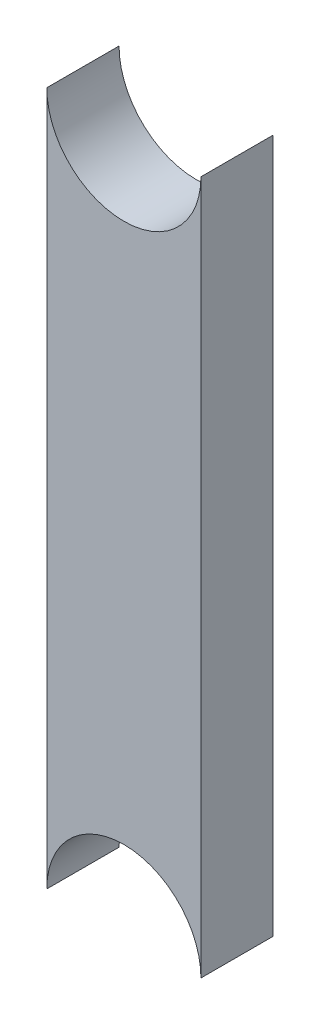
ISO-10303-21;
HEADER;
FILE_DESCRIPTION(('STEP AP214'),'2;1');
FILE_NAME('part.step','',(''),(''),'','','');
FILE_SCHEMA(('AUTOMOTIVE_DESIGN { 1 0 10303 214 1 1 1 1 }'));
ENDSEC;
DATA;
#1=APPLICATION_CONTEXT('core data for automotive mechanical design processes');
#2=APPLICATION_PROTOCOL_DEFINITION('international standard','automotive_design',2000,#1);
#3=PRODUCT_CONTEXT('',#1,'mechanical');
#4=PRODUCT('Part','Part','',(#3));
#5=PRODUCT_RELATED_PRODUCT_CATEGORY('part','',(#4));
#6=PRODUCT_DEFINITION_FORMATION('','',#4);
#7=PRODUCT_DEFINITION_CONTEXT('part definition',#1,'design');
#8=PRODUCT_DEFINITION('design','',#6,#7);
#9=PRODUCT_DEFINITION_SHAPE('','',#8);
#10=(LENGTH_UNIT() NAMED_UNIT(*) SI_UNIT(.MILLI.,.METRE.));
#11=(NAMED_UNIT(*) PLANE_ANGLE_UNIT() SI_UNIT($,.RADIAN.));
#12=(NAMED_UNIT(*) SI_UNIT($,.STERADIAN.) SOLID_ANGLE_UNIT());
#13=UNCERTAINTY_MEASURE_WITH_UNIT(LENGTH_MEASURE(1.E-05),#10,'distance_accuracy_value','');
#14=(GEOMETRIC_REPRESENTATION_CONTEXT(3) GLOBAL_UNCERTAINTY_ASSIGNED_CONTEXT((#13)) GLOBAL_UNIT_ASSIGNED_CONTEXT((#10,
#11,#12)) REPRESENTATION_CONTEXT('',''));
#15=CARTESIAN_POINT('',(0.,0.,0.));
#16=DIRECTION('',(0.,0.,1.));
#17=DIRECTION('',(1.,0.,0.));
#18=AXIS2_PLACEMENT_3D('',#15,#16,#17);
#19=CARTESIAN_POINT('',(0.,28.8,3.));
#20=DIRECTION('',(0.,0.,-1.));
#21=DIRECTION('',(-1.,0.,0.));
#22=AXIS2_PLACEMENT_3D('',#19,#20,#21);
#23=CYLINDRICAL_SURFACE('',#22,3.2);
#24=CARTESIAN_POINT('',(0.,28.8,0.));
#25=DIRECTION('',(0.,0.,-1.));
#26=DIRECTION('',(1.,0.,0.));
#27=AXIS2_PLACEMENT_3D('',#24,#25,#26);
#28=CIRCLE('',#27,3.2);
#29=CARTESIAN_POINT('',(3.2,28.8,0.));
#30=VERTEX_POINT('',#29);
#31=CARTESIAN_POINT('',(-3.2,28.8,0.));
#32=VERTEX_POINT('',#31);
#33=EDGE_CURVE('E106',#30,#32,#28,.T.);
#34=ORIENTED_EDGE('',*,*,#33,.T.);
#35=DIRECTION('',(0.,0.,-1.));
#36=VECTOR('',#35,1.);
#37=CARTESIAN_POINT('',(-3.2,28.8,3.));
#38=LINE('',#37,#36);
#39=CARTESIAN_POINT('',(-3.2,28.8,3.));
#40=VERTEX_POINT('',#39);
#41=EDGE_CURVE('E11',#40,#32,#38,.T.);
#42=ORIENTED_EDGE('',*,*,#41,.F.);
#43=CARTESIAN_POINT('',(0.,28.8,3.));
#44=DIRECTION('',(0.,0.,-1.));
#45=DIRECTION('',(1.,0.,0.));
#46=AXIS2_PLACEMENT_3D('',#43,#44,#45);
#47=CIRCLE('',#46,3.2);
#48=CARTESIAN_POINT('',(3.2,28.8,3.));
#49=VERTEX_POINT('',#48);
#50=EDGE_CURVE('E94',#49,#40,#47,.T.);
#51=ORIENTED_EDGE('',*,*,#50,.F.);
#52=DIRECTION('',(0.,0.,-1.));
#53=VECTOR('',#52,1.);
#54=CARTESIAN_POINT('',(3.2,28.8,3.));
#55=LINE('',#54,#53);
#56=EDGE_CURVE('E102',#49,#30,#55,.T.);
#57=ORIENTED_EDGE('',*,*,#56,.T.);
#58=EDGE_LOOP('',(#34,#42,#51,#57));
#59=FACE_BOUND('',#58,.T.);
#60=ADVANCED_FACE('F43',(#59),#23,.F.);
#61=CARTESIAN_POINT('',(-3.2,0.,3.));
#62=DIRECTION('',(1.,0.,0.));
#63=DIRECTION('',(0.,1.,0.));
#64=AXIS2_PLACEMENT_3D('',#61,#62,#63);
#65=PLANE('',#64);
#66=DIRECTION('',(0.,-1.,0.));
#67=VECTOR('',#66,1.);
#68=CARTESIAN_POINT('',(-3.2,0.,0.));
#69=LINE('',#68,#67);
#70=CARTESIAN_POINT('',(-3.2,0.,0.));
#71=VERTEX_POINT('',#70);
#72=EDGE_CURVE('E98',#32,#71,#69,.T.);
#73=ORIENTED_EDGE('',*,*,#72,.T.);
#74=DIRECTION('',(0.,0.,-1.));
#75=VECTOR('',#74,1.);
#76=CARTESIAN_POINT('',(-3.2,0.,3.));
#77=LINE('',#76,#75);
#78=CARTESIAN_POINT('',(-3.2,0.,3.));
#79=VERTEX_POINT('',#78);
#80=EDGE_CURVE('E51',#79,#71,#77,.T.);
#81=ORIENTED_EDGE('',*,*,#80,.F.);
#82=DIRECTION('',(0.,-1.,0.));
#83=VECTOR('',#82,1.);
#84=CARTESIAN_POINT('',(-3.2,0.,3.));
#85=LINE('',#84,#83);
#86=EDGE_CURVE('E89',#40,#79,#85,.T.);
#87=ORIENTED_EDGE('',*,*,#86,.F.);
#88=ORIENTED_EDGE('',*,*,#41,.T.);
#89=EDGE_LOOP('',(#73,#81,#87,#88));
#90=FACE_BOUND('',#89,.T.);
#91=ADVANCED_FACE('F97',(#90),#65,.F.);
#92=CARTESIAN_POINT('',(0.,0.,3.));
#93=DIRECTION('',(0.,0.,-1.));
#94=DIRECTION('',(-1.,0.,0.));
#95=AXIS2_PLACEMENT_3D('',#92,#93,#94);
#96=CYLINDRICAL_SURFACE('',#95,3.2);
#97=CARTESIAN_POINT('',(0.,0.,0.));
#98=DIRECTION('',(0.,0.,-1.));
#99=DIRECTION('',(1.,0.,0.));
#100=AXIS2_PLACEMENT_3D('',#97,#98,#99);
#101=CIRCLE('',#100,3.2);
#102=CARTESIAN_POINT('',(3.2,0.,0.));
#103=VERTEX_POINT('',#102);
#104=EDGE_CURVE('E76',#71,#103,#101,.T.);
#105=ORIENTED_EDGE('',*,*,#104,.T.);
#106=DIRECTION('',(0.,0.,-1.));
#107=VECTOR('',#106,1.);
#108=CARTESIAN_POINT('',(3.2,0.,3.));
#109=LINE('',#108,#107);
#110=CARTESIAN_POINT('',(3.2,0.,3.));
#111=VERTEX_POINT('',#110);
#112=EDGE_CURVE('E99',#111,#103,#109,.T.);
#113=ORIENTED_EDGE('',*,*,#112,.F.);
#114=CARTESIAN_POINT('',(0.,0.,3.));
#115=DIRECTION('',(0.,0.,-1.));
#116=DIRECTION('',(1.,0.,0.));
#117=AXIS2_PLACEMENT_3D('',#114,#115,#116);
#118=CIRCLE('',#117,3.2);
#119=EDGE_CURVE('E92',#79,#111,#118,.T.);
#120=ORIENTED_EDGE('',*,*,#119,.F.);
#121=ORIENTED_EDGE('',*,*,#80,.T.);
#122=EDGE_LOOP('',(#105,#113,#120,#121));
#123=FACE_BOUND('',#122,.T.);
#124=ADVANCED_FACE('F100',(#123),#96,.F.);
#125=CARTESIAN_POINT('',(3.2,28.8,3.));
#126=DIRECTION('',(-1.,0.,0.));
#127=DIRECTION('',(0.,-1.,0.));
#128=AXIS2_PLACEMENT_3D('',#125,#126,#127);
#129=PLANE('',#128);
#130=DIRECTION('',(0.,1.,0.));
#131=VECTOR('',#130,1.);
#132=CARTESIAN_POINT('',(3.2,28.8,0.));
#133=LINE('',#132,#131);
#134=EDGE_CURVE('E82',#103,#30,#133,.T.);
#135=ORIENTED_EDGE('',*,*,#134,.T.);
#136=ORIENTED_EDGE('',*,*,#56,.F.);
#137=DIRECTION('',(0.,1.,0.));
#138=VECTOR('',#137,1.);
#139=CARTESIAN_POINT('',(3.2,28.8,3.));
#140=LINE('',#139,#138);
#141=EDGE_CURVE('E59',#111,#49,#140,.T.);
#142=ORIENTED_EDGE('',*,*,#141,.F.);
#143=ORIENTED_EDGE('',*,*,#112,.T.);
#144=EDGE_LOOP('',(#135,#136,#142,#143));
#145=FACE_BOUND('',#144,.T.);
#146=ADVANCED_FACE('F113',(#145),#129,.F.);
#147=CARTESIAN_POINT('',(0.,28.8,3.));
#148=DIRECTION('',(0.,0.,1.));
#149=DIRECTION('',(1.,0.,0.));
#150=AXIS2_PLACEMENT_3D('',#147,#148,#149);
#151=PLANE('',#150);
#152=ORIENTED_EDGE('',*,*,#50,.T.);
#153=ORIENTED_EDGE('',*,*,#86,.T.);
#154=ORIENTED_EDGE('',*,*,#119,.T.);
#155=ORIENTED_EDGE('',*,*,#141,.T.);
#156=EDGE_LOOP('',(#152,#153,#154,#155));
#157=FACE_BOUND('',#156,.T.);
#158=ADVANCED_FACE('F90',(#157),#151,.T.);
#159=CARTESIAN_POINT('',(0.,28.8,0.));
#160=DIRECTION('',(0.,0.,1.));
#161=DIRECTION('',(1.,0.,0.));
#162=AXIS2_PLACEMENT_3D('',#159,#160,#161);
#163=PLANE('',#162);
#164=ORIENTED_EDGE('',*,*,#33,.F.);
#165=ORIENTED_EDGE('',*,*,#134,.F.);
#166=ORIENTED_EDGE('',*,*,#104,.F.);
#167=ORIENTED_EDGE('',*,*,#72,.F.);
#168=EDGE_LOOP('',(#164,#165,#166,#167));
#169=FACE_BOUND('',#168,.T.);
#170=ADVANCED_FACE('F116',(#169),#163,.F.);
#171=CLOSED_SHELL('',(#60,#91,#124,#146,#158,#170));
#172=MANIFOLD_SOLID_BREP('B2',#171);
#173=ADVANCED_BREP_SHAPE_REPRESENTATION('',(#18,#172),#14);
#174=SHAPE_DEFINITION_REPRESENTATION(#9,#173);
ENDSEC;
END-ISO-10303-21;
